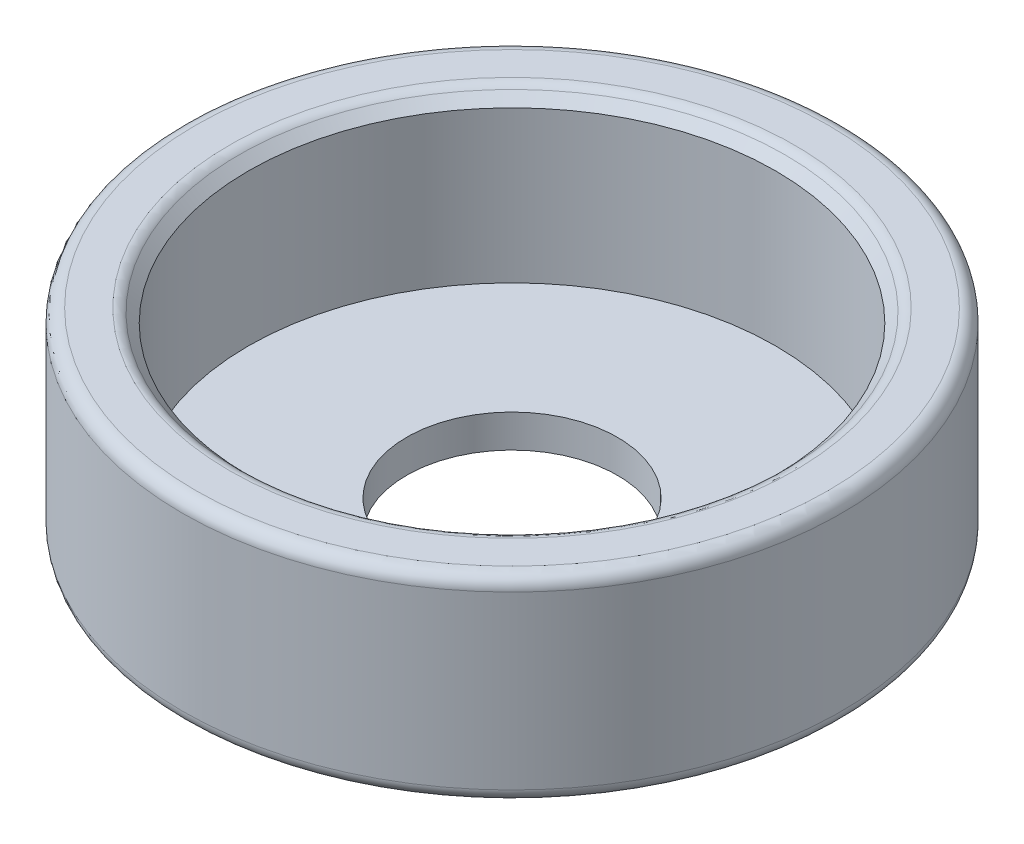
ISO-10303-21;
HEADER;
FILE_DESCRIPTION(('STEP AP214'),'2;1');
FILE_NAME('part.step','',(''),(''),'','','');
FILE_SCHEMA(('AUTOMOTIVE_DESIGN { 1 0 10303 214 1 1 1 1 }'));
ENDSEC;
DATA;
#1=APPLICATION_CONTEXT('core data for automotive mechanical design processes');
#2=APPLICATION_PROTOCOL_DEFINITION('international standard','automotive_design',2000,#1);
#3=PRODUCT_CONTEXT('',#1,'mechanical');
#4=PRODUCT('Part','Part','',(#3));
#5=PRODUCT_RELATED_PRODUCT_CATEGORY('part','',(#4));
#6=PRODUCT_DEFINITION_FORMATION('','',#4);
#7=PRODUCT_DEFINITION_CONTEXT('part definition',#1,'design');
#8=PRODUCT_DEFINITION('design','',#6,#7);
#9=PRODUCT_DEFINITION_SHAPE('','',#8);
#10=(LENGTH_UNIT() NAMED_UNIT(*) SI_UNIT(.MILLI.,.METRE.));
#11=(NAMED_UNIT(*) PLANE_ANGLE_UNIT() SI_UNIT($,.RADIAN.));
#12=(NAMED_UNIT(*) SI_UNIT($,.STERADIAN.) SOLID_ANGLE_UNIT());
#13=UNCERTAINTY_MEASURE_WITH_UNIT(LENGTH_MEASURE(1.E-05),#10,'distance_accuracy_value','');
#14=(GEOMETRIC_REPRESENTATION_CONTEXT(3) GLOBAL_UNCERTAINTY_ASSIGNED_CONTEXT((#13)) GLOBAL_UNIT_ASSIGNED_CONTEXT((#10,
#11,#12)) REPRESENTATION_CONTEXT('',''));
#15=CARTESIAN_POINT('',(0.,0.,0.));
#16=DIRECTION('',(0.,0.,1.));
#17=DIRECTION('',(1.,0.,0.));
#18=AXIS2_PLACEMENT_3D('',#15,#16,#17);
#19=CARTESIAN_POINT('',(0.,3.,0.));
#20=DIRECTION('',(0.,-1.,0.));
#21=DIRECTION('',(0.,0.,-1.));
#22=AXIS2_PLACEMENT_3D('',#19,#20,#21);
#23=CYLINDRICAL_SURFACE('',#22,1.6);
#24=CARTESIAN_POINT('',(0.,0.,0.));
#25=DIRECTION('',(0.,1.,0.));
#26=DIRECTION('',(0.,0.,1.));
#27=AXIS2_PLACEMENT_3D('',#24,#25,#26);
#28=CIRCLE('',#27,1.6);
#29=CARTESIAN_POINT('',(0.,0.,1.6));
#30=VERTEX_POINT('',#29);
#31=EDGE_CURVE('E63',#30,#30,#28,.T.);
#32=ORIENTED_EDGE('',*,*,#31,.F.);
#33=EDGE_LOOP('',(#32));
#34=FACE_BOUND('',#33,.T.);
#35=CARTESIAN_POINT('',(0.,0.5,0.));
#36=DIRECTION('',(0.,1.,0.));
#37=DIRECTION('',(0.,0.,1.));
#38=AXIS2_PLACEMENT_3D('',#35,#36,#37);
#39=CIRCLE('',#38,1.6);
#40=CARTESIAN_POINT('',(0.,0.5,1.6));
#41=VERTEX_POINT('',#40);
#42=EDGE_CURVE('E64',#41,#41,#39,.T.);
#43=ORIENTED_EDGE('',*,*,#42,.T.);
#44=EDGE_LOOP('',(#43));
#45=FACE_BOUND('',#44,.T.);
#46=ADVANCED_FACE('F34',(#34,#45),#23,.F.);
#47=CARTESIAN_POINT('',(0.,3.,0.));
#48=DIRECTION('',(0.,1.,0.));
#49=DIRECTION('',(0.,0.,1.));
#50=AXIS2_PLACEMENT_3D('',#47,#48,#49);
#51=PLANE('',#50);
#52=CARTESIAN_POINT('',(0.,3.,0.));
#53=DIRECTION('',(0.,1.,0.));
#54=DIRECTION('',(0.,0.,1.));
#55=AXIS2_PLACEMENT_3D('',#52,#53,#54);
#56=CIRCLE('',#55,4.8);
#57=CARTESIAN_POINT('',(0.,3.,4.8));
#58=VERTEX_POINT('',#57);
#59=EDGE_CURVE('E54',#58,#58,#56,.T.);
#60=ORIENTED_EDGE('',*,*,#59,.T.);
#61=EDGE_LOOP('',(#60));
#62=FACE_BOUND('',#61,.T.);
#63=CARTESIAN_POINT('',(0.,3.,0.));
#64=DIRECTION('',(0.,1.,0.));
#65=DIRECTION('',(0.,0.,1.));
#66=AXIS2_PLACEMENT_3D('',#63,#64,#65);
#67=CIRCLE('',#66,4.28284271247462);
#68=CARTESIAN_POINT('',(0.,3.,4.28284271247462));
#69=VERTEX_POINT('',#68);
#70=EDGE_CURVE('E57',#69,#69,#67,.F.);
#71=ORIENTED_EDGE('',*,*,#70,.T.);
#72=EDGE_LOOP('',(#71));
#73=FACE_BOUND('',#72,.T.);
#74=ADVANCED_FACE('F92',(#62,#73),#51,.T.);
#75=CARTESIAN_POINT('',(0.,0.,0.));
#76=DIRECTION('',(0.,1.,0.));
#77=DIRECTION('',(0.,0.,1.));
#78=AXIS2_PLACEMENT_3D('',#75,#76,#77);
#79=PLANE('',#78);
#80=CARTESIAN_POINT('',(0.,0.,0.));
#81=DIRECTION('',(0.,1.,0.));
#82=DIRECTION('',(0.,0.,1.));
#83=AXIS2_PLACEMENT_3D('',#80,#81,#82);
#84=CIRCLE('',#83,4.8);
#85=CARTESIAN_POINT('',(0.,0.,4.8));
#86=VERTEX_POINT('',#85);
#87=EDGE_CURVE('E10',#86,#86,#84,.F.);
#88=ORIENTED_EDGE('',*,*,#87,.T.);
#89=EDGE_LOOP('',(#88));
#90=FACE_BOUND('',#89,.T.);
#91=ORIENTED_EDGE('',*,*,#31,.T.);
#92=EDGE_LOOP('',(#91));
#93=FACE_BOUND('',#92,.T.);
#94=ADVANCED_FACE('F87',(#90,#93),#79,.F.);
#95=CARTESIAN_POINT('',(0.,3.,0.));
#96=DIRECTION('',(0.,-1.,0.));
#97=DIRECTION('',(0.,0.,-1.));
#98=AXIS2_PLACEMENT_3D('',#95,#96,#97);
#99=CYLINDRICAL_SURFACE('',#98,5.);
#100=CARTESIAN_POINT('',(0.,2.8,0.));
#101=DIRECTION('',(0.,1.,0.));
#102=DIRECTION('',(0.,0.,1.));
#103=AXIS2_PLACEMENT_3D('',#100,#101,#102);
#104=CIRCLE('',#103,5.);
#105=CARTESIAN_POINT('',(0.,2.8,5.));
#106=VERTEX_POINT('',#105);
#107=EDGE_CURVE('E45',#106,#106,#104,.F.);
#108=ORIENTED_EDGE('',*,*,#107,.T.);
#109=EDGE_LOOP('',(#108));
#110=FACE_BOUND('',#109,.T.);
#111=CARTESIAN_POINT('',(0.,0.2,0.));
#112=DIRECTION('',(0.,1.,0.));
#113=DIRECTION('',(0.,0.,1.));
#114=AXIS2_PLACEMENT_3D('',#111,#112,#113);
#115=CIRCLE('',#114,5.);
#116=CARTESIAN_POINT('',(0.,0.2,5.));
#117=VERTEX_POINT('',#116);
#118=EDGE_CURVE('E49',#117,#117,#115,.T.);
#119=ORIENTED_EDGE('',*,*,#118,.T.);
#120=EDGE_LOOP('',(#119));
#121=FACE_BOUND('',#120,.T.);
#122=ADVANCED_FACE('F77',(#110,#121),#99,.T.);
#123=CARTESIAN_POINT('',(0.,0.5,0.));
#124=DIRECTION('',(0.,1.,0.));
#125=DIRECTION('',(0.,0.,1.));
#126=AXIS2_PLACEMENT_3D('',#123,#124,#125);
#127=CYLINDRICAL_SURFACE('',#126,4.);
#128=CARTESIAN_POINT('',(0.,2.8,0.));
#129=DIRECTION('',(0.,1.,0.));
#130=DIRECTION('',(0.,0.,1.));
#131=AXIS2_PLACEMENT_3D('',#128,#129,#130);
#132=CIRCLE('',#131,4.);
#133=CARTESIAN_POINT('',(0.,2.8,4.));
#134=VERTEX_POINT('',#133);
#135=EDGE_CURVE('E60',#134,#134,#132,.T.);
#136=ORIENTED_EDGE('',*,*,#135,.T.);
#137=EDGE_LOOP('',(#136));
#138=FACE_BOUND('',#137,.T.);
#139=CARTESIAN_POINT('',(0.,0.5,0.));
#140=DIRECTION('',(0.,1.,0.));
#141=DIRECTION('',(0.,0.,1.));
#142=AXIS2_PLACEMENT_3D('',#139,#140,#141);
#143=CIRCLE('',#142,4.);
#144=CARTESIAN_POINT('',(0.,0.5,4.));
#145=VERTEX_POINT('',#144);
#146=EDGE_CURVE('E67',#145,#145,#143,.T.);
#147=ORIENTED_EDGE('',*,*,#146,.F.);
#148=EDGE_LOOP('',(#147));
#149=FACE_BOUND('',#148,.T.);
#150=ADVANCED_FACE('F75',(#138,#149),#127,.F.);
#151=CARTESIAN_POINT('',(0.,0.5,0.));
#152=DIRECTION('',(0.,1.,0.));
#153=DIRECTION('',(0.,0.,1.));
#154=AXIS2_PLACEMENT_3D('',#151,#152,#153);
#155=PLANE('',#154);
#156=ORIENTED_EDGE('',*,*,#42,.F.);
#157=EDGE_LOOP('',(#156));
#158=FACE_BOUND('',#157,.T.);
#159=ORIENTED_EDGE('',*,*,#146,.T.);
#160=EDGE_LOOP('',(#159));
#161=FACE_BOUND('',#160,.T.);
#162=ADVANCED_FACE('F73',(#158,#161),#155,.T.);
#163=CARTESIAN_POINT('',(0.,2.8,0.));
#164=DIRECTION('',(0.,1.,0.));
#165=DIRECTION('',(0.,0.,1.));
#166=AXIS2_PLACEMENT_3D('',#163,#164,#165);
#167=CONICAL_SURFACE('',#166,4.,0.78539816339745);
#168=CARTESIAN_POINT('',(0.,2.94142135623731,0.));
#169=DIRECTION('',(0.,-1.,0.));
#170=DIRECTION('',(0.,0.,-1.));
#171=AXIS2_PLACEMENT_3D('',#168,#169,#170);
#172=CIRCLE('',#171,4.14142135623731);
#173=CARTESIAN_POINT('',(0.,2.94142135623731,-4.14142135623731));
#174=VERTEX_POINT('',#173);
#175=EDGE_CURVE('E41',#174,#174,#172,.F.);
#176=ORIENTED_EDGE('',*,*,#175,.T.);
#177=EDGE_LOOP('',(#176));
#178=FACE_BOUND('',#177,.T.);
#179=ORIENTED_EDGE('',*,*,#135,.F.);
#180=EDGE_LOOP('',(#179));
#181=FACE_BOUND('',#180,.T.);
#182=ADVANCED_FACE('F84',(#178,#181),#167,.F.);
#183=CARTESIAN_POINT('',(0.,2.8,0.));
#184=DIRECTION('',(0.,1.,0.));
#185=DIRECTION('',(0.,0.,1.));
#186=AXIS2_PLACEMENT_3D('',#183,#184,#185);
#187=TOROIDAL_SURFACE('',#186,4.8,0.2);
#188=ORIENTED_EDGE('',*,*,#107,.F.);
#189=EDGE_LOOP('',(#188));
#190=FACE_BOUND('',#189,.T.);
#191=ORIENTED_EDGE('',*,*,#59,.F.);
#192=EDGE_LOOP('',(#191));
#193=FACE_BOUND('',#192,.T.);
#194=ADVANCED_FACE('F106',(#190,#193),#187,.T.);
#195=CARTESIAN_POINT('',(0.,2.8,0.));
#196=DIRECTION('',(0.,1.,0.));
#197=DIRECTION('',(0.,0.,1.));
#198=AXIS2_PLACEMENT_3D('',#195,#196,#197);
#199=TOROIDAL_SURFACE('',#198,4.28284271247462,0.2);
#200=ORIENTED_EDGE('',*,*,#175,.F.);
#201=EDGE_LOOP('',(#200));
#202=FACE_BOUND('',#201,.T.);
#203=ORIENTED_EDGE('',*,*,#70,.F.);
#204=EDGE_LOOP('',(#203));
#205=FACE_BOUND('',#204,.T.);
#206=ADVANCED_FACE('F108',(#202,#205),#199,.T.);
#207=CARTESIAN_POINT('',(0.,0.2,0.));
#208=DIRECTION('',(0.,1.,0.));
#209=DIRECTION('',(0.,0.,1.));
#210=AXIS2_PLACEMENT_3D('',#207,#208,#209);
#211=TOROIDAL_SURFACE('',#210,4.8,0.2);
#212=ORIENTED_EDGE('',*,*,#87,.F.);
#213=EDGE_LOOP('',(#212));
#214=FACE_BOUND('',#213,.T.);
#215=ORIENTED_EDGE('',*,*,#118,.F.);
#216=EDGE_LOOP('',(#215));
#217=FACE_BOUND('',#216,.T.);
#218=ADVANCED_FACE('F36',(#214,#217),#211,.T.);
#219=CLOSED_SHELL('',(#46,#74,#94,#122,#150,#162,#182,#194,#206,#218));
#220=MANIFOLD_SOLID_BREP('B2',#219);
#221=ADVANCED_BREP_SHAPE_REPRESENTATION('',(#18,#220),#14);
#222=SHAPE_DEFINITION_REPRESENTATION(#9,#221);
ENDSEC;
END-ISO-10303-21;
